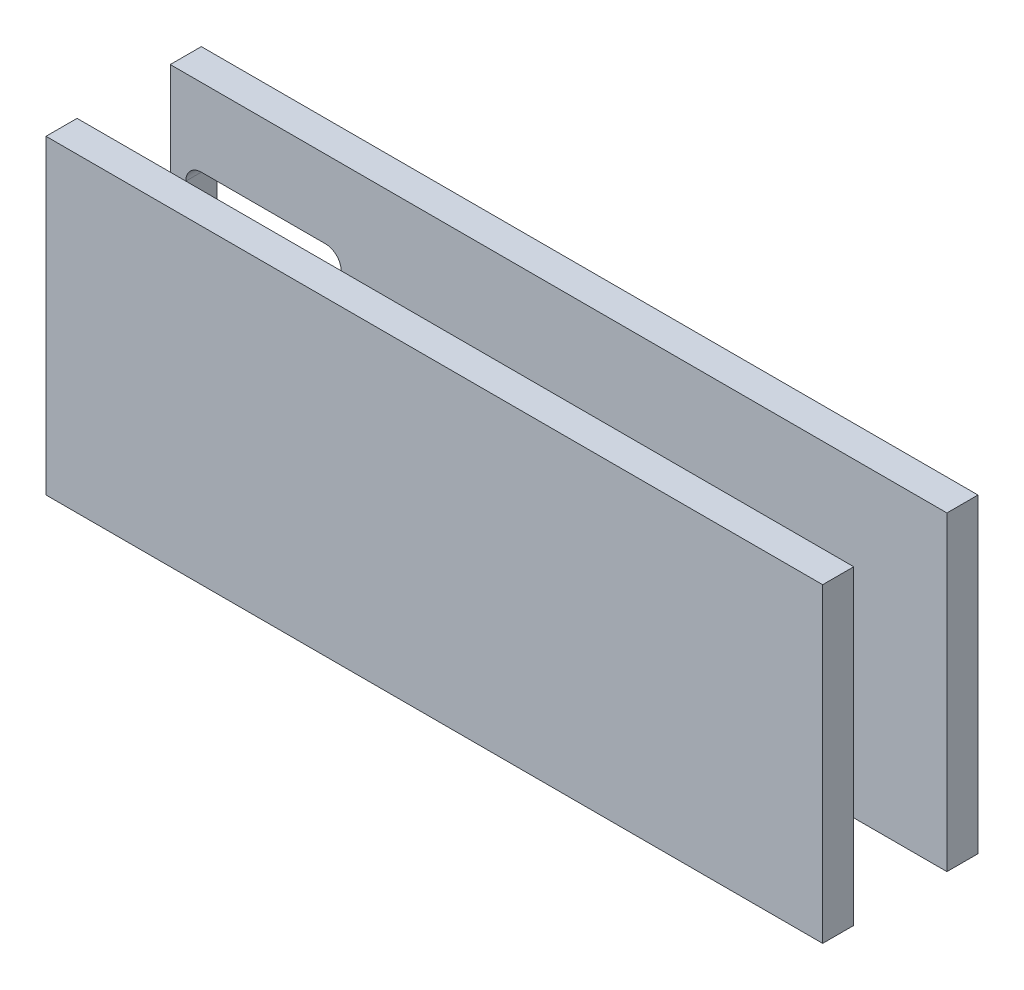
ISO-10303-21;
HEADER;
FILE_DESCRIPTION(('STEP AP214'),'2;1');
FILE_NAME('part.step','',(''),(''),'','','');
FILE_SCHEMA(('AUTOMOTIVE_DESIGN { 1 0 10303 214 1 1 1 1 }'));
ENDSEC;
DATA;
#1=APPLICATION_CONTEXT('core data for automotive mechanical design processes');
#2=APPLICATION_PROTOCOL_DEFINITION('international standard','automotive_design',2000,#1);
#3=PRODUCT_CONTEXT('',#1,'mechanical');
#4=PRODUCT('Part','Part','',(#3));
#5=PRODUCT_RELATED_PRODUCT_CATEGORY('part','',(#4));
#6=PRODUCT_DEFINITION_FORMATION('','',#4);
#7=PRODUCT_DEFINITION_CONTEXT('part definition',#1,'design');
#8=PRODUCT_DEFINITION('design','',#6,#7);
#9=PRODUCT_DEFINITION_SHAPE('','',#8);
#10=(LENGTH_UNIT() NAMED_UNIT(*) SI_UNIT(.MILLI.,.METRE.));
#11=(NAMED_UNIT(*) PLANE_ANGLE_UNIT() SI_UNIT($,.RADIAN.));
#12=(NAMED_UNIT(*) SI_UNIT($,.STERADIAN.) SOLID_ANGLE_UNIT());
#13=UNCERTAINTY_MEASURE_WITH_UNIT(LENGTH_MEASURE(1.E-05),#10,'distance_accuracy_value','');
#14=(GEOMETRIC_REPRESENTATION_CONTEXT(3) GLOBAL_UNCERTAINTY_ASSIGNED_CONTEXT((#13)) GLOBAL_UNIT_ASSIGNED_CONTEXT((#10,
#11,#12)) REPRESENTATION_CONTEXT('',''));
#15=CARTESIAN_POINT('',(0.,0.,0.));
#16=DIRECTION('',(0.,0.,1.));
#17=DIRECTION('',(1.,0.,0.));
#18=AXIS2_PLACEMENT_3D('',#15,#16,#17);
#19=CARTESIAN_POINT('',(0.,0.,10.));
#20=DIRECTION('',(0.,0.,1.));
#21=DIRECTION('',(1.,0.,0.));
#22=AXIS2_PLACEMENT_3D('',#19,#20,#21);
#23=PLANE('',#22);
#24=DIRECTION('',(-1.,0.,0.));
#25=VECTOR('',#24,1.);
#26=CARTESIAN_POINT('',(-70.,-25.,10.));
#27=LINE('',#26,#25);
#28=CARTESIAN_POINT('',(-75.,-25.,10.));
#29=VERTEX_POINT('',#28);
#30=CARTESIAN_POINT('',(-115.,-25.,10.));
#31=VERTEX_POINT('',#30);
#32=EDGE_CURVE('E273',#29,#31,#27,.T.);
#33=ORIENTED_EDGE('',*,*,#32,.T.);
#34=CARTESIAN_POINT('',(-115.,-20.,10.));
#35=DIRECTION('',(0.,0.,1.));
#36=DIRECTION('',(1.,0.,0.));
#37=AXIS2_PLACEMENT_3D('',#34,#35,#36);
#38=CIRCLE('',#37,5.);
#39=CARTESIAN_POINT('',(-120.,-20.,10.));
#40=VERTEX_POINT('',#39);
#41=EDGE_CURVE('E241',#31,#40,#38,.F.);
#42=ORIENTED_EDGE('',*,*,#41,.T.);
#43=DIRECTION('',(0.,1.,0.));
#44=VECTOR('',#43,1.);
#45=CARTESIAN_POINT('',(-120.,25.,10.));
#46=LINE('',#45,#44);
#47=CARTESIAN_POINT('',(-120.,20.,10.));
#48=VERTEX_POINT('',#47);
#49=EDGE_CURVE('E270',#40,#48,#46,.T.);
#50=ORIENTED_EDGE('',*,*,#49,.T.);
#51=CARTESIAN_POINT('',(-115.,20.,10.));
#52=DIRECTION('',(0.,0.,1.));
#53=DIRECTION('',(1.,0.,0.));
#54=AXIS2_PLACEMENT_3D('',#51,#52,#53);
#55=CIRCLE('',#54,5.);
#56=CARTESIAN_POINT('',(-115.,25.,10.));
#57=VERTEX_POINT('',#56);
#58=EDGE_CURVE('E11',#48,#57,#55,.F.);
#59=ORIENTED_EDGE('',*,*,#58,.T.);
#60=DIRECTION('',(1.,0.,0.));
#61=VECTOR('',#60,1.);
#62=CARTESIAN_POINT('',(-70.,25.,10.));
#63=LINE('',#62,#61);
#64=CARTESIAN_POINT('',(-75.,25.,10.));
#65=VERTEX_POINT('',#64);
#66=EDGE_CURVE('E267',#57,#65,#63,.T.);
#67=ORIENTED_EDGE('',*,*,#66,.T.);
#68=CARTESIAN_POINT('',(-75.,20.,10.));
#69=DIRECTION('',(0.,0.,1.));
#70=DIRECTION('',(1.,0.,0.));
#71=AXIS2_PLACEMENT_3D('',#68,#69,#70);
#72=CIRCLE('',#71,5.);
#73=CARTESIAN_POINT('',(-70.,20.,10.));
#74=VERTEX_POINT('',#73);
#75=EDGE_CURVE('E249',#65,#74,#72,.F.);
#76=ORIENTED_EDGE('',*,*,#75,.T.);
#77=DIRECTION('',(0.,-1.,0.));
#78=VECTOR('',#77,1.);
#79=CARTESIAN_POINT('',(-70.,25.,10.));
#80=LINE('',#79,#78);
#81=CARTESIAN_POINT('',(-70.,-20.,10.));
#82=VERTEX_POINT('',#81);
#83=EDGE_CURVE('E269',#74,#82,#80,.T.);
#84=ORIENTED_EDGE('',*,*,#83,.T.);
#85=CARTESIAN_POINT('',(-75.,-20.,10.));
#86=DIRECTION('',(0.,0.,1.));
#87=DIRECTION('',(1.,0.,0.));
#88=AXIS2_PLACEMENT_3D('',#85,#86,#87);
#89=CIRCLE('',#88,5.);
#90=EDGE_CURVE('E245',#82,#29,#89,.F.);
#91=ORIENTED_EDGE('',*,*,#90,.T.);
#92=EDGE_LOOP('',(#33,#42,#50,#59,#67,#76,#84,#91));
#93=FACE_BOUND('',#92,.T.);
#94=CARTESIAN_POINT('',(75.,0.,10.));
#95=DIRECTION('',(0.,0.,1.));
#96=DIRECTION('',(1.,0.,0.));
#97=AXIS2_PLACEMENT_3D('',#94,#95,#96);
#98=CIRCLE('',#97,5.);
#99=CARTESIAN_POINT('',(80.,0.,10.));
#100=VERTEX_POINT('',#99);
#101=EDGE_CURVE('E183',#100,#100,#98,.T.);
#102=ORIENTED_EDGE('',*,*,#101,.F.);
#103=EDGE_LOOP('',(#102));
#104=FACE_BOUND('',#103,.T.);
#105=DIRECTION('',(0.,1.,0.));
#106=VECTOR('',#105,1.);
#107=CARTESIAN_POINT('',(125.,50.,10.));
#108=LINE('',#107,#106);
#109=CARTESIAN_POINT('',(125.,-50.,10.));
#110=VERTEX_POINT('',#109);
#111=CARTESIAN_POINT('',(125.,50.,10.));
#112=VERTEX_POINT('',#111);
#113=EDGE_CURVE('E191',#110,#112,#108,.T.);
#114=ORIENTED_EDGE('',*,*,#113,.T.);
#115=DIRECTION('',(-1.,0.,0.));
#116=VECTOR('',#115,1.);
#117=CARTESIAN_POINT('',(-125.,50.,10.));
#118=LINE('',#117,#116);
#119=CARTESIAN_POINT('',(-125.,50.,10.));
#120=VERTEX_POINT('',#119);
#121=EDGE_CURVE('E194',#112,#120,#118,.T.);
#122=ORIENTED_EDGE('',*,*,#121,.T.);
#123=DIRECTION('',(0.,-1.,0.));
#124=VECTOR('',#123,1.);
#125=CARTESIAN_POINT('',(-125.,50.,10.));
#126=LINE('',#125,#124);
#127=CARTESIAN_POINT('',(-125.,-50.,10.));
#128=VERTEX_POINT('',#127);
#129=EDGE_CURVE('E197',#120,#128,#126,.T.);
#130=ORIENTED_EDGE('',*,*,#129,.T.);
#131=DIRECTION('',(1.,0.,0.));
#132=VECTOR('',#131,1.);
#133=CARTESIAN_POINT('',(-125.,-50.,10.));
#134=LINE('',#133,#132);
#135=EDGE_CURVE('E199',#128,#110,#134,.T.);
#136=ORIENTED_EDGE('',*,*,#135,.T.);
#137=EDGE_LOOP('',(#114,#122,#130,#136));
#138=FACE_BOUND('',#137,.T.);
#139=CARTESIAN_POINT('',(-25.,0.,10.));
#140=DIRECTION('',(0.,0.,1.));
#141=DIRECTION('',(1.,0.,0.));
#142=AXIS2_PLACEMENT_3D('',#139,#140,#141);
#143=CIRCLE('',#142,5.);
#144=CARTESIAN_POINT('',(-20.,0.,10.));
#145=VERTEX_POINT('',#144);
#146=EDGE_CURVE('E173',#145,#145,#143,.T.);
#147=ORIENTED_EDGE('',*,*,#146,.F.);
#148=EDGE_LOOP('',(#147));
#149=FACE_BOUND('',#148,.T.);
#150=ADVANCED_FACE('F35',(#93,#104,#138,#149),#23,.T.);
#151=CARTESIAN_POINT('',(125.,50.,10.));
#152=DIRECTION('',(-1.,0.,0.));
#153=DIRECTION('',(0.,0.,1.));
#154=AXIS2_PLACEMENT_3D('',#151,#152,#153);
#155=PLANE('',#154);
#156=DIRECTION('',(0.,1.,0.));
#157=VECTOR('',#156,1.);
#158=CARTESIAN_POINT('',(125.,50.,0.));
#159=LINE('',#158,#157);
#160=CARTESIAN_POINT('',(125.,-50.,0.));
#161=VERTEX_POINT('',#160);
#162=CARTESIAN_POINT('',(125.,50.,0.));
#163=VERTEX_POINT('',#162);
#164=EDGE_CURVE('E188',#161,#163,#159,.T.);
#165=ORIENTED_EDGE('',*,*,#164,.T.);
#166=DIRECTION('',(0.,0.,-1.));
#167=VECTOR('',#166,1.);
#168=CARTESIAN_POINT('',(125.,50.,10.));
#169=LINE('',#168,#167);
#170=EDGE_CURVE('E217',#112,#163,#169,.T.);
#171=ORIENTED_EDGE('',*,*,#170,.F.);
#172=ORIENTED_EDGE('',*,*,#113,.F.);
#173=DIRECTION('',(0.,0.,-1.));
#174=VECTOR('',#173,1.);
#175=CARTESIAN_POINT('',(125.,-50.,10.));
#176=LINE('',#175,#174);
#177=EDGE_CURVE('E201',#110,#161,#176,.T.);
#178=ORIENTED_EDGE('',*,*,#177,.T.);
#179=EDGE_LOOP('',(#165,#171,#172,#178));
#180=FACE_BOUND('',#179,.T.);
#181=ADVANCED_FACE('F315',(#180),#155,.F.);
#182=CARTESIAN_POINT('',(-125.,50.,10.));
#183=DIRECTION('',(0.,-1.,0.));
#184=DIRECTION('',(0.,0.,-1.));
#185=AXIS2_PLACEMENT_3D('',#182,#183,#184);
#186=PLANE('',#185);
#187=DIRECTION('',(-1.,0.,0.));
#188=VECTOR('',#187,1.);
#189=CARTESIAN_POINT('',(-125.,50.,0.));
#190=LINE('',#189,#188);
#191=CARTESIAN_POINT('',(-125.,50.,0.));
#192=VERTEX_POINT('',#191);
#193=EDGE_CURVE('E204',#163,#192,#190,.T.);
#194=ORIENTED_EDGE('',*,*,#193,.T.);
#195=DIRECTION('',(0.,0.,-1.));
#196=VECTOR('',#195,1.);
#197=CARTESIAN_POINT('',(-125.,50.,10.));
#198=LINE('',#197,#196);
#199=EDGE_CURVE('E214',#120,#192,#198,.T.);
#200=ORIENTED_EDGE('',*,*,#199,.F.);
#201=ORIENTED_EDGE('',*,*,#121,.F.);
#202=ORIENTED_EDGE('',*,*,#170,.T.);
#203=EDGE_LOOP('',(#194,#200,#201,#202));
#204=FACE_BOUND('',#203,.T.);
#205=ADVANCED_FACE('F320',(#204),#186,.F.);
#206=CARTESIAN_POINT('',(-125.,50.,10.));
#207=DIRECTION('',(1.,0.,0.));
#208=DIRECTION('',(0.,1.,0.));
#209=AXIS2_PLACEMENT_3D('',#206,#207,#208);
#210=PLANE('',#209);
#211=DIRECTION('',(0.,-1.,0.));
#212=VECTOR('',#211,1.);
#213=CARTESIAN_POINT('',(-125.,50.,0.));
#214=LINE('',#213,#212);
#215=CARTESIAN_POINT('',(-125.,-50.,0.));
#216=VERTEX_POINT('',#215);
#217=EDGE_CURVE('E206',#192,#216,#214,.T.);
#218=ORIENTED_EDGE('',*,*,#217,.T.);
#219=DIRECTION('',(0.,0.,-1.));
#220=VECTOR('',#219,1.);
#221=CARTESIAN_POINT('',(-125.,-50.,10.));
#222=LINE('',#221,#220);
#223=EDGE_CURVE('E211',#128,#216,#222,.T.);
#224=ORIENTED_EDGE('',*,*,#223,.F.);
#225=ORIENTED_EDGE('',*,*,#129,.F.);
#226=ORIENTED_EDGE('',*,*,#199,.T.);
#227=EDGE_LOOP('',(#218,#224,#225,#226));
#228=FACE_BOUND('',#227,.T.);
#229=ADVANCED_FACE('F333',(#228),#210,.F.);
#230=CARTESIAN_POINT('',(-125.,-50.,10.));
#231=DIRECTION('',(0.,1.,0.));
#232=DIRECTION('',(0.,0.,1.));
#233=AXIS2_PLACEMENT_3D('',#230,#231,#232);
#234=PLANE('',#233);
#235=DIRECTION('',(1.,0.,0.));
#236=VECTOR('',#235,1.);
#237=CARTESIAN_POINT('',(-125.,-50.,0.));
#238=LINE('',#237,#236);
#239=EDGE_CURVE('E195',#216,#161,#238,.T.);
#240=ORIENTED_EDGE('',*,*,#239,.T.);
#241=ORIENTED_EDGE('',*,*,#177,.F.);
#242=ORIENTED_EDGE('',*,*,#135,.F.);
#243=ORIENTED_EDGE('',*,*,#223,.T.);
#244=EDGE_LOOP('',(#240,#241,#242,#243));
#245=FACE_BOUND('',#244,.T.);
#246=ADVANCED_FACE('F330',(#245),#234,.F.);
#247=CARTESIAN_POINT('',(0.,0.,0.));
#248=DIRECTION('',(0.,0.,1.));
#249=DIRECTION('',(1.,0.,0.));
#250=AXIS2_PLACEMENT_3D('',#247,#248,#249);
#251=PLANE('',#250);
#252=DIRECTION('',(1.,0.,0.));
#253=VECTOR('',#252,1.);
#254=CARTESIAN_POINT('',(-70.,25.,0.));
#255=LINE('',#254,#253);
#256=CARTESIAN_POINT('',(-115.,25.,0.));
#257=VERTEX_POINT('',#256);
#258=CARTESIAN_POINT('',(-75.,25.,0.));
#259=VERTEX_POINT('',#258);
#260=EDGE_CURVE('E257',#257,#259,#255,.T.);
#261=ORIENTED_EDGE('',*,*,#260,.F.);
#262=CARTESIAN_POINT('',(-115.,20.,0.));
#263=DIRECTION('',(0.,0.,1.));
#264=DIRECTION('',(1.,0.,0.));
#265=AXIS2_PLACEMENT_3D('',#262,#263,#264);
#266=CIRCLE('',#265,5.);
#267=CARTESIAN_POINT('',(-120.,20.,0.));
#268=VERTEX_POINT('',#267);
#269=EDGE_CURVE('E43',#257,#268,#266,.T.);
#270=ORIENTED_EDGE('',*,*,#269,.T.);
#271=DIRECTION('',(0.,1.,0.));
#272=VECTOR('',#271,1.);
#273=CARTESIAN_POINT('',(-120.,25.,0.));
#274=LINE('',#273,#272);
#275=CARTESIAN_POINT('',(-120.,-20.,0.));
#276=VERTEX_POINT('',#275);
#277=EDGE_CURVE('E256',#276,#268,#274,.T.);
#278=ORIENTED_EDGE('',*,*,#277,.F.);
#279=CARTESIAN_POINT('',(-115.,-20.,0.));
#280=DIRECTION('',(0.,0.,1.));
#281=DIRECTION('',(1.,0.,0.));
#282=AXIS2_PLACEMENT_3D('',#279,#280,#281);
#283=CIRCLE('',#282,5.);
#284=CARTESIAN_POINT('',(-115.,-25.,0.));
#285=VERTEX_POINT('',#284);
#286=EDGE_CURVE('E239',#276,#285,#283,.T.);
#287=ORIENTED_EDGE('',*,*,#286,.T.);
#288=DIRECTION('',(-1.,0.,0.));
#289=VECTOR('',#288,1.);
#290=CARTESIAN_POINT('',(-70.,-25.,0.));
#291=LINE('',#290,#289);
#292=CARTESIAN_POINT('',(-75.,-25.,0.));
#293=VERTEX_POINT('',#292);
#294=EDGE_CURVE('E275',#293,#285,#291,.T.);
#295=ORIENTED_EDGE('',*,*,#294,.F.);
#296=CARTESIAN_POINT('',(-75.,-20.,0.));
#297=DIRECTION('',(0.,0.,1.));
#298=DIRECTION('',(1.,0.,0.));
#299=AXIS2_PLACEMENT_3D('',#296,#297,#298);
#300=CIRCLE('',#299,5.);
#301=CARTESIAN_POINT('',(-70.,-20.,0.));
#302=VERTEX_POINT('',#301);
#303=EDGE_CURVE('E243',#293,#302,#300,.T.);
#304=ORIENTED_EDGE('',*,*,#303,.T.);
#305=DIRECTION('',(0.,-1.,0.));
#306=VECTOR('',#305,1.);
#307=CARTESIAN_POINT('',(-70.,25.,0.));
#308=LINE('',#307,#306);
#309=CARTESIAN_POINT('',(-70.,20.,0.));
#310=VERTEX_POINT('',#309);
#311=EDGE_CURVE('E281',#310,#302,#308,.T.);
#312=ORIENTED_EDGE('',*,*,#311,.F.);
#313=CARTESIAN_POINT('',(-75.,20.,0.));
#314=DIRECTION('',(0.,0.,1.));
#315=DIRECTION('',(1.,0.,0.));
#316=AXIS2_PLACEMENT_3D('',#313,#314,#315);
#317=CIRCLE('',#316,5.);
#318=EDGE_CURVE('E247',#310,#259,#317,.T.);
#319=ORIENTED_EDGE('',*,*,#318,.T.);
#320=EDGE_LOOP('',(#261,#270,#278,#287,#295,#304,#312,#319));
#321=FACE_BOUND('',#320,.T.);
#322=ORIENTED_EDGE('',*,*,#164,.F.);
#323=ORIENTED_EDGE('',*,*,#239,.F.);
#324=ORIENTED_EDGE('',*,*,#217,.F.);
#325=ORIENTED_EDGE('',*,*,#193,.F.);
#326=EDGE_LOOP('',(#322,#323,#324,#325));
#327=FACE_BOUND('',#326,.T.);
#328=ADVANCED_FACE('F254',(#321,#327),#251,.F.);
#329=CARTESIAN_POINT('',(75.,0.,40.));
#330=DIRECTION('',(0.,0.,-1.));
#331=DIRECTION('',(-1.,0.,0.));
#332=AXIS2_PLACEMENT_3D('',#329,#330,#331);
#333=CYLINDRICAL_SURFACE('',#332,5.);
#334=CARTESIAN_POINT('',(75.,0.,40.));
#335=DIRECTION('',(0.,0.,1.));
#336=DIRECTION('',(1.,0.,0.));
#337=AXIS2_PLACEMENT_3D('',#334,#335,#336);
#338=CIRCLE('',#337,5.);
#339=CARTESIAN_POINT('',(80.,0.,40.));
#340=VERTEX_POINT('',#339);
#341=EDGE_CURVE('E185',#340,#340,#338,.T.);
#342=ORIENTED_EDGE('',*,*,#341,.F.);
#343=EDGE_LOOP('',(#342));
#344=FACE_BOUND('',#343,.T.);
#345=ORIENTED_EDGE('',*,*,#101,.T.);
#346=EDGE_LOOP('',(#345));
#347=FACE_BOUND('',#346,.T.);
#348=ADVANCED_FACE('F326',(#344,#347),#333,.T.);
#349=CARTESIAN_POINT('',(-25.,0.,40.));
#350=DIRECTION('',(0.,0.,-1.));
#351=DIRECTION('',(-1.,0.,0.));
#352=AXIS2_PLACEMENT_3D('',#349,#350,#351);
#353=CYLINDRICAL_SURFACE('',#352,5.);
#354=CARTESIAN_POINT('',(-25.,0.,40.));
#355=DIRECTION('',(0.,0.,1.));
#356=DIRECTION('',(1.,0.,0.));
#357=AXIS2_PLACEMENT_3D('',#354,#355,#356);
#358=CIRCLE('',#357,5.);
#359=CARTESIAN_POINT('',(-20.,0.,40.));
#360=VERTEX_POINT('',#359);
#361=EDGE_CURVE('E176',#360,#360,#358,.T.);
#362=ORIENTED_EDGE('',*,*,#361,.F.);
#363=EDGE_LOOP('',(#362));
#364=FACE_BOUND('',#363,.T.);
#365=ORIENTED_EDGE('',*,*,#146,.T.);
#366=EDGE_LOOP('',(#365));
#367=FACE_BOUND('',#366,.T.);
#368=ADVANCED_FACE('F382',(#364,#367),#353,.T.);
#369=CARTESIAN_POINT('',(0.,0.,40.));
#370=DIRECTION('',(0.,0.,1.));
#371=DIRECTION('',(1.,0.,0.));
#372=AXIS2_PLACEMENT_3D('',#369,#370,#371);
#373=PLANE('',#372);
#374=ORIENTED_EDGE('',*,*,#361,.T.);
#375=EDGE_LOOP('',(#374));
#376=FACE_BOUND('',#375,.T.);
#377=DIRECTION('',(0.,1.,0.));
#378=VECTOR('',#377,1.);
#379=CARTESIAN_POINT('',(125.,50.,40.));
#380=LINE('',#379,#378);
#381=CARTESIAN_POINT('',(125.,-50.,40.));
#382=VERTEX_POINT('',#381);
#383=CARTESIAN_POINT('',(125.,50.,40.));
#384=VERTEX_POINT('',#383);
#385=EDGE_CURVE('E172',#382,#384,#380,.T.);
#386=ORIENTED_EDGE('',*,*,#385,.F.);
#387=DIRECTION('',(1.,0.,0.));
#388=VECTOR('',#387,1.);
#389=CARTESIAN_POINT('',(-125.,-50.,40.));
#390=LINE('',#389,#388);
#391=CARTESIAN_POINT('',(-125.,-50.,40.));
#392=VERTEX_POINT('',#391);
#393=EDGE_CURVE('E168',#392,#382,#390,.T.);
#394=ORIENTED_EDGE('',*,*,#393,.F.);
#395=DIRECTION('',(0.,-1.,0.));
#396=VECTOR('',#395,1.);
#397=CARTESIAN_POINT('',(-125.,50.,40.));
#398=LINE('',#397,#396);
#399=CARTESIAN_POINT('',(-125.,50.,40.));
#400=VERTEX_POINT('',#399);
#401=EDGE_CURVE('E292',#400,#392,#398,.T.);
#402=ORIENTED_EDGE('',*,*,#401,.F.);
#403=DIRECTION('',(-1.,0.,0.));
#404=VECTOR('',#403,1.);
#405=CARTESIAN_POINT('',(-125.,50.,40.));
#406=LINE('',#405,#404);
#407=EDGE_CURVE('E290',#384,#400,#406,.T.);
#408=ORIENTED_EDGE('',*,*,#407,.F.);
#409=EDGE_LOOP('',(#386,#394,#402,#408));
#410=FACE_BOUND('',#409,.T.);
#411=ORIENTED_EDGE('',*,*,#341,.T.);
#412=EDGE_LOOP('',(#411));
#413=FACE_BOUND('',#412,.T.);
#414=ADVANCED_FACE('F303',(#376,#410,#413),#373,.F.);
#415=CARTESIAN_POINT('',(125.,50.,50.));
#416=DIRECTION('',(-1.,0.,0.));
#417=DIRECTION('',(0.,0.,1.));
#418=AXIS2_PLACEMENT_3D('',#415,#416,#417);
#419=PLANE('',#418);
#420=ORIENTED_EDGE('',*,*,#385,.T.);
#421=DIRECTION('',(0.,0.,-1.));
#422=VECTOR('',#421,1.);
#423=CARTESIAN_POINT('',(125.,50.,50.));
#424=LINE('',#423,#422);
#425=CARTESIAN_POINT('',(125.,50.,50.));
#426=VERTEX_POINT('',#425);
#427=EDGE_CURVE('E152',#426,#384,#424,.T.);
#428=ORIENTED_EDGE('',*,*,#427,.F.);
#429=DIRECTION('',(0.,1.,0.));
#430=VECTOR('',#429,1.);
#431=CARTESIAN_POINT('',(125.,50.,50.));
#432=LINE('',#431,#430);
#433=CARTESIAN_POINT('',(125.,-50.,50.));
#434=VERTEX_POINT('',#433);
#435=EDGE_CURVE('E159',#434,#426,#432,.T.);
#436=ORIENTED_EDGE('',*,*,#435,.F.);
#437=DIRECTION('',(0.,0.,-1.));
#438=VECTOR('',#437,1.);
#439=CARTESIAN_POINT('',(125.,-50.,50.));
#440=LINE('',#439,#438);
#441=EDGE_CURVE('E288',#434,#382,#440,.T.);
#442=ORIENTED_EDGE('',*,*,#441,.T.);
#443=EDGE_LOOP('',(#420,#428,#436,#442));
#444=FACE_BOUND('',#443,.T.);
#445=ADVANCED_FACE('F170',(#444),#419,.F.);
#446=CARTESIAN_POINT('',(-125.,50.,50.));
#447=DIRECTION('',(0.,-1.,0.));
#448=DIRECTION('',(0.,0.,-1.));
#449=AXIS2_PLACEMENT_3D('',#446,#447,#448);
#450=PLANE('',#449);
#451=ORIENTED_EDGE('',*,*,#407,.T.);
#452=DIRECTION('',(0.,0.,-1.));
#453=VECTOR('',#452,1.);
#454=CARTESIAN_POINT('',(-125.,50.,50.));
#455=LINE('',#454,#453);
#456=CARTESIAN_POINT('',(-125.,50.,50.));
#457=VERTEX_POINT('',#456);
#458=EDGE_CURVE('E155',#457,#400,#455,.T.);
#459=ORIENTED_EDGE('',*,*,#458,.F.);
#460=DIRECTION('',(-1.,0.,0.));
#461=VECTOR('',#460,1.);
#462=CARTESIAN_POINT('',(-125.,50.,50.));
#463=LINE('',#462,#461);
#464=EDGE_CURVE('E148',#426,#457,#463,.T.);
#465=ORIENTED_EDGE('',*,*,#464,.F.);
#466=ORIENTED_EDGE('',*,*,#427,.T.);
#467=EDGE_LOOP('',(#451,#459,#465,#466));
#468=FACE_BOUND('',#467,.T.);
#469=ADVANCED_FACE('F150',(#468),#450,.F.);
#470=CARTESIAN_POINT('',(-125.,50.,50.));
#471=DIRECTION('',(1.,0.,0.));
#472=DIRECTION('',(0.,0.,-1.));
#473=AXIS2_PLACEMENT_3D('',#470,#471,#472);
#474=PLANE('',#473);
#475=ORIENTED_EDGE('',*,*,#401,.T.);
#476=DIRECTION('',(0.,0.,-1.));
#477=VECTOR('',#476,1.);
#478=CARTESIAN_POINT('',(-125.,-50.,50.));
#479=LINE('',#478,#477);
#480=CARTESIAN_POINT('',(-125.,-50.,50.));
#481=VERTEX_POINT('',#480);
#482=EDGE_CURVE('E178',#481,#392,#479,.T.);
#483=ORIENTED_EDGE('',*,*,#482,.F.);
#484=DIRECTION('',(0.,-1.,0.));
#485=VECTOR('',#484,1.);
#486=CARTESIAN_POINT('',(-125.,50.,50.));
#487=LINE('',#486,#485);
#488=EDGE_CURVE('E158',#457,#481,#487,.T.);
#489=ORIENTED_EDGE('',*,*,#488,.F.);
#490=ORIENTED_EDGE('',*,*,#458,.T.);
#491=EDGE_LOOP('',(#475,#483,#489,#490));
#492=FACE_BOUND('',#491,.T.);
#493=ADVANCED_FACE('F305',(#492),#474,.F.);
#494=CARTESIAN_POINT('',(-125.,-50.,50.));
#495=DIRECTION('',(0.,1.,0.));
#496=DIRECTION('',(0.,0.,1.));
#497=AXIS2_PLACEMENT_3D('',#494,#495,#496);
#498=PLANE('',#497);
#499=ORIENTED_EDGE('',*,*,#393,.T.);
#500=ORIENTED_EDGE('',*,*,#441,.F.);
#501=DIRECTION('',(1.,0.,0.));
#502=VECTOR('',#501,1.);
#503=CARTESIAN_POINT('',(-125.,-50.,50.));
#504=LINE('',#503,#502);
#505=EDGE_CURVE('E164',#481,#434,#504,.T.);
#506=ORIENTED_EDGE('',*,*,#505,.F.);
#507=ORIENTED_EDGE('',*,*,#482,.T.);
#508=EDGE_LOOP('',(#499,#500,#506,#507));
#509=FACE_BOUND('',#508,.T.);
#510=ADVANCED_FACE('F299',(#509),#498,.F.);
#511=CARTESIAN_POINT('',(0.,0.,50.));
#512=DIRECTION('',(0.,0.,1.));
#513=DIRECTION('',(1.,0.,0.));
#514=AXIS2_PLACEMENT_3D('',#511,#512,#513);
#515=PLANE('',#514);
#516=ORIENTED_EDGE('',*,*,#435,.T.);
#517=ORIENTED_EDGE('',*,*,#464,.T.);
#518=ORIENTED_EDGE('',*,*,#488,.T.);
#519=ORIENTED_EDGE('',*,*,#505,.T.);
#520=EDGE_LOOP('',(#516,#517,#518,#519));
#521=FACE_BOUND('',#520,.T.);
#522=ADVANCED_FACE('F162',(#521),#515,.T.);
#523=CARTESIAN_POINT('',(-120.,25.,10.));
#524=DIRECTION('',(-1.,0.,0.));
#525=DIRECTION('',(0.,-1.,0.));
#526=AXIS2_PLACEMENT_3D('',#523,#524,#525);
#527=PLANE('',#526);
#528=ORIENTED_EDGE('',*,*,#49,.F.);
#529=DIRECTION('',(0.,0.,-1.));
#530=VECTOR('',#529,1.);
#531=CARTESIAN_POINT('',(-120.,-20.,0.));
#532=LINE('',#531,#530);
#533=EDGE_CURVE('E222',#40,#276,#532,.T.);
#534=ORIENTED_EDGE('',*,*,#533,.T.);
#535=ORIENTED_EDGE('',*,*,#277,.T.);
#536=DIRECTION('',(0.,0.,-1.));
#537=VECTOR('',#536,1.);
#538=CARTESIAN_POINT('',(-120.,20.,10.));
#539=LINE('',#538,#537);
#540=EDGE_CURVE('E220',#268,#48,#539,.F.);
#541=ORIENTED_EDGE('',*,*,#540,.T.);
#542=EDGE_LOOP('',(#528,#534,#535,#541));
#543=FACE_BOUND('',#542,.T.);
#544=ADVANCED_FACE('F263',(#543),#527,.F.);
#545=CARTESIAN_POINT('',(-70.,-25.,10.));
#546=DIRECTION('',(0.,-1.,0.));
#547=DIRECTION('',(0.,0.,-1.));
#548=AXIS2_PLACEMENT_3D('',#545,#546,#547);
#549=PLANE('',#548);
#550=ORIENTED_EDGE('',*,*,#294,.T.);
#551=DIRECTION('',(0.,0.,-1.));
#552=VECTOR('',#551,1.);
#553=CARTESIAN_POINT('',(-115.,-25.,10.));
#554=LINE('',#553,#552);
#555=EDGE_CURVE('E228',#285,#31,#554,.F.);
#556=ORIENTED_EDGE('',*,*,#555,.T.);
#557=ORIENTED_EDGE('',*,*,#32,.F.);
#558=DIRECTION('',(0.,0.,-1.));
#559=VECTOR('',#558,1.);
#560=CARTESIAN_POINT('',(-75.,-25.,0.));
#561=LINE('',#560,#559);
#562=EDGE_CURVE('E225',#29,#293,#561,.T.);
#563=ORIENTED_EDGE('',*,*,#562,.T.);
#564=EDGE_LOOP('',(#550,#556,#557,#563));
#565=FACE_BOUND('',#564,.T.);
#566=ADVANCED_FACE('F365',(#565),#549,.F.);
#567=CARTESIAN_POINT('',(-70.,25.,10.));
#568=DIRECTION('',(1.,0.,0.));
#569=DIRECTION('',(0.,0.,-1.));
#570=AXIS2_PLACEMENT_3D('',#567,#568,#569);
#571=PLANE('',#570);
#572=ORIENTED_EDGE('',*,*,#311,.T.);
#573=DIRECTION('',(0.,0.,-1.));
#574=VECTOR('',#573,1.);
#575=CARTESIAN_POINT('',(-70.,-20.,10.));
#576=LINE('',#575,#574);
#577=EDGE_CURVE('E233',#302,#82,#576,.F.);
#578=ORIENTED_EDGE('',*,*,#577,.T.);
#579=ORIENTED_EDGE('',*,*,#83,.F.);
#580=DIRECTION('',(0.,0.,-1.));
#581=VECTOR('',#580,1.);
#582=CARTESIAN_POINT('',(-70.,20.,0.));
#583=LINE('',#582,#581);
#584=EDGE_CURVE('E230',#74,#310,#583,.T.);
#585=ORIENTED_EDGE('',*,*,#584,.T.);
#586=EDGE_LOOP('',(#572,#578,#579,#585));
#587=FACE_BOUND('',#586,.T.);
#588=ADVANCED_FACE('F358',(#587),#571,.F.);
#589=CARTESIAN_POINT('',(-70.,25.,10.));
#590=DIRECTION('',(0.,1.,0.));
#591=DIRECTION('',(0.,0.,1.));
#592=AXIS2_PLACEMENT_3D('',#589,#590,#591);
#593=PLANE('',#592);
#594=ORIENTED_EDGE('',*,*,#260,.T.);
#595=DIRECTION('',(0.,0.,-1.));
#596=VECTOR('',#595,1.);
#597=CARTESIAN_POINT('',(-75.,25.,10.));
#598=LINE('',#597,#596);
#599=EDGE_CURVE('E50',#259,#65,#598,.F.);
#600=ORIENTED_EDGE('',*,*,#599,.T.);
#601=ORIENTED_EDGE('',*,*,#66,.F.);
#602=DIRECTION('',(0.,0.,-1.));
#603=VECTOR('',#602,1.);
#604=CARTESIAN_POINT('',(-115.,25.,0.));
#605=LINE('',#604,#603);
#606=EDGE_CURVE('E235',#57,#257,#605,.T.);
#607=ORIENTED_EDGE('',*,*,#606,.T.);
#608=EDGE_LOOP('',(#594,#600,#601,#607));
#609=FACE_BOUND('',#608,.T.);
#610=ADVANCED_FACE('F266',(#609),#593,.F.);
#611=CARTESIAN_POINT('',(-115.,-20.,10.));
#612=DIRECTION('',(0.,0.,1.));
#613=DIRECTION('',(1.,0.,0.));
#614=AXIS2_PLACEMENT_3D('',#611,#612,#613);
#615=CYLINDRICAL_SURFACE('',#614,5.);
#616=ORIENTED_EDGE('',*,*,#41,.F.);
#617=ORIENTED_EDGE('',*,*,#555,.F.);
#618=ORIENTED_EDGE('',*,*,#286,.F.);
#619=ORIENTED_EDGE('',*,*,#533,.F.);
#620=EDGE_LOOP('',(#616,#617,#618,#619));
#621=FACE_BOUND('',#620,.T.);
#622=ADVANCED_FACE('F341',(#621),#615,.F.);
#623=CARTESIAN_POINT('',(-75.,-20.,10.));
#624=DIRECTION('',(0.,0.,1.));
#625=DIRECTION('',(1.,0.,0.));
#626=AXIS2_PLACEMENT_3D('',#623,#624,#625);
#627=CYLINDRICAL_SURFACE('',#626,5.);
#628=ORIENTED_EDGE('',*,*,#90,.F.);
#629=ORIENTED_EDGE('',*,*,#577,.F.);
#630=ORIENTED_EDGE('',*,*,#303,.F.);
#631=ORIENTED_EDGE('',*,*,#562,.F.);
#632=EDGE_LOOP('',(#628,#629,#630,#631));
#633=FACE_BOUND('',#632,.T.);
#634=ADVANCED_FACE('F344',(#633),#627,.F.);
#635=CARTESIAN_POINT('',(-75.,20.,10.));
#636=DIRECTION('',(0.,0.,1.));
#637=DIRECTION('',(1.,0.,0.));
#638=AXIS2_PLACEMENT_3D('',#635,#636,#637);
#639=CYLINDRICAL_SURFACE('',#638,5.);
#640=ORIENTED_EDGE('',*,*,#75,.F.);
#641=ORIENTED_EDGE('',*,*,#599,.F.);
#642=ORIENTED_EDGE('',*,*,#318,.F.);
#643=ORIENTED_EDGE('',*,*,#584,.F.);
#644=EDGE_LOOP('',(#640,#641,#642,#643));
#645=FACE_BOUND('',#644,.T.);
#646=ADVANCED_FACE('F347',(#645),#639,.F.);
#647=CARTESIAN_POINT('',(-115.,20.,10.));
#648=DIRECTION('',(0.,0.,1.));
#649=DIRECTION('',(1.,0.,0.));
#650=AXIS2_PLACEMENT_3D('',#647,#648,#649);
#651=CYLINDRICAL_SURFACE('',#650,5.);
#652=ORIENTED_EDGE('',*,*,#58,.F.);
#653=ORIENTED_EDGE('',*,*,#540,.F.);
#654=ORIENTED_EDGE('',*,*,#269,.F.);
#655=ORIENTED_EDGE('',*,*,#606,.F.);
#656=EDGE_LOOP('',(#652,#653,#654,#655));
#657=FACE_BOUND('',#656,.T.);
#658=ADVANCED_FACE('F37',(#657),#651,.F.);
#659=CLOSED_SHELL('',(#150,#181,#205,#229,#246,#328,#348,#368,#414,#445,#469,#493,#510,#522,
#544,#566,#588,#610,#622,#634,#646,#658));
#660=MANIFOLD_SOLID_BREP('B2',#659);
#661=ADVANCED_BREP_SHAPE_REPRESENTATION('',(#18,#660),#14);
#662=SHAPE_DEFINITION_REPRESENTATION(#9,#661);
ENDSEC;
END-ISO-10303-21;
